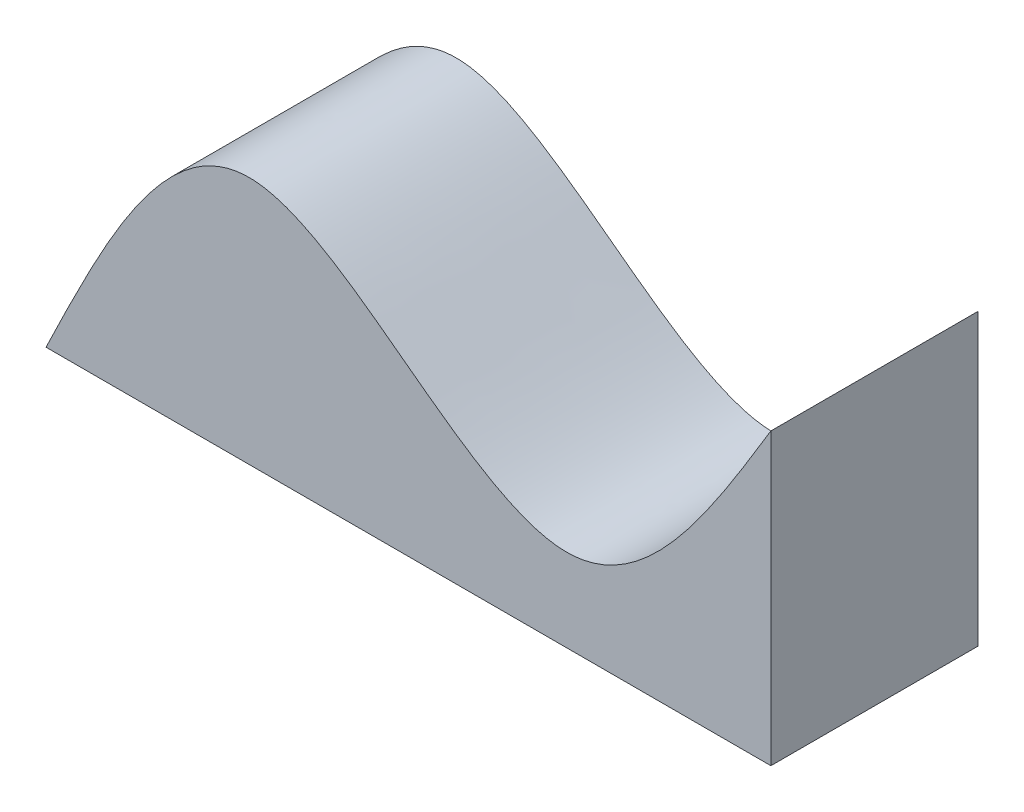
ISO-10303-21;
HEADER;
FILE_DESCRIPTION(('STEP AP214'),'2;1');
FILE_NAME('part.step','',(''),(''),'','','');
FILE_SCHEMA(('AUTOMOTIVE_DESIGN { 1 0 10303 214 1 1 1 1 }'));
ENDSEC;
DATA;
#1=APPLICATION_CONTEXT('core data for automotive mechanical design processes');
#2=APPLICATION_PROTOCOL_DEFINITION('international standard','automotive_design',2000,#1);
#3=PRODUCT_CONTEXT('',#1,'mechanical');
#4=PRODUCT('Part','Part','',(#3));
#5=PRODUCT_RELATED_PRODUCT_CATEGORY('part','',(#4));
#6=PRODUCT_DEFINITION_FORMATION('','',#4);
#7=PRODUCT_DEFINITION_CONTEXT('part definition',#1,'design');
#8=PRODUCT_DEFINITION('design','',#6,#7);
#9=PRODUCT_DEFINITION_SHAPE('','',#8);
#10=(LENGTH_UNIT() NAMED_UNIT(*) SI_UNIT(.MILLI.,.METRE.));
#11=(NAMED_UNIT(*) PLANE_ANGLE_UNIT() SI_UNIT($,.RADIAN.));
#12=(NAMED_UNIT(*) SI_UNIT($,.STERADIAN.) SOLID_ANGLE_UNIT());
#13=UNCERTAINTY_MEASURE_WITH_UNIT(LENGTH_MEASURE(1.E-05),#10,'distance_accuracy_value','');
#14=(GEOMETRIC_REPRESENTATION_CONTEXT(3) GLOBAL_UNCERTAINTY_ASSIGNED_CONTEXT((#13)) GLOBAL_UNIT_ASSIGNED_CONTEXT((#10,
#11,#12)) REPRESENTATION_CONTEXT('',''));
#15=CARTESIAN_POINT('',(0.,0.,0.));
#16=DIRECTION('',(0.,0.,1.));
#17=DIRECTION('',(1.,0.,0.));
#18=AXIS2_PLACEMENT_3D('',#15,#16,#17);
#19=CARTESIAN_POINT('',(35.,14.,10.));
#20=CARTESIAN_POINT('',(31.9413193605141,8.93762404776543,10.));
#21=CARTESIAN_POINT('',(25.2058552241985,-2.21014052452845,10.));
#22=CARTESIAN_POINT('',(9.0923652441554,18.8202864775659,10.));
#23=CARTESIAN_POINT('',(2.94411992329052,6.09403371870198,10.));
#24=CARTESIAN_POINT('',(0.,0.,10.));
#25=B_SPLINE_CURVE_WITH_KNOTS('',3,(#19,#20,#21,#22,#23,#24),.UNSPECIFIED.,.F.,.F.,(4,1,1,4),
(0.,0.30242383969866,0.665961951032433,1.),.UNSPECIFIED.);
#26=DIRECTION('',(0.,0.,-1.));
#27=VECTOR('',#26,1.);
#28=SURFACE_OF_LINEAR_EXTRUSION('',#25,#27);
#29=CARTESIAN_POINT('',(35.,14.,0.));
#30=CARTESIAN_POINT('',(31.9413193605141,8.93762404776543,0.));
#31=CARTESIAN_POINT('',(25.2058552241985,-2.21014052452845,0.));
#32=CARTESIAN_POINT('',(9.0923652441554,18.8202864775659,0.));
#33=CARTESIAN_POINT('',(2.94411992329052,6.09403371870198,0.));
#34=CARTESIAN_POINT('',(0.,0.,0.));
#35=B_SPLINE_CURVE_WITH_KNOTS('',3,(#29,#30,#31,#32,#33,#34),.UNSPECIFIED.,.F.,.F.,(4,1,1,4),
(0.,0.30242383969866,0.665961951032433,1.),.UNSPECIFIED.);
#36=CARTESIAN_POINT('',(35.,14.,0.));
#37=VERTEX_POINT('',#36);
#38=CARTESIAN_POINT('',(0.,0.,0.));
#39=VERTEX_POINT('',#38);
#40=EDGE_CURVE('E82',#37,#39,#35,.T.);
#41=ORIENTED_EDGE('',*,*,#40,.T.);
#42=DIRECTION('',(0.,0.,-1.));
#43=VECTOR('',#42,1.);
#44=CARTESIAN_POINT('',(0.,0.,10.));
#45=LINE('',#44,#43);
#46=CARTESIAN_POINT('',(0.,0.,10.));
#47=VERTEX_POINT('',#46);
#48=EDGE_CURVE('E11',#47,#39,#45,.T.);
#49=ORIENTED_EDGE('',*,*,#48,.F.);
#50=CARTESIAN_POINT('',(35.,14.,10.));
#51=VERTEX_POINT('',#50);
#52=EDGE_CURVE('E76',#51,#47,#25,.T.);
#53=ORIENTED_EDGE('',*,*,#52,.F.);
#54=DIRECTION('',(0.,0.,-1.));
#55=VECTOR('',#54,1.);
#56=CARTESIAN_POINT('',(35.,14.,10.));
#57=LINE('',#56,#55);
#58=EDGE_CURVE('E83',#51,#37,#57,.T.);
#59=ORIENTED_EDGE('',*,*,#58,.T.);
#60=EDGE_LOOP('',(#41,#49,#53,#59));
#61=FACE_BOUND('',#60,.T.);
#62=ADVANCED_FACE('F35',(#61),#28,.F.);
#63=CARTESIAN_POINT('',(35.,0.,10.));
#64=DIRECTION('',(0.,1.,0.));
#65=DIRECTION('',(0.,0.,1.));
#66=AXIS2_PLACEMENT_3D('',#63,#64,#65);
#67=PLANE('',#66);
#68=DIRECTION('',(1.,0.,0.));
#69=VECTOR('',#68,1.);
#70=CARTESIAN_POINT('',(35.,0.,0.));
#71=LINE('',#70,#69);
#72=CARTESIAN_POINT('',(35.,0.,0.));
#73=VERTEX_POINT('',#72);
#74=EDGE_CURVE('E64',#39,#73,#71,.T.);
#75=ORIENTED_EDGE('',*,*,#74,.T.);
#76=DIRECTION('',(0.,0.,-1.));
#77=VECTOR('',#76,1.);
#78=CARTESIAN_POINT('',(35.,0.,10.));
#79=LINE('',#78,#77);
#80=CARTESIAN_POINT('',(35.,0.,10.));
#81=VERTEX_POINT('',#80);
#82=EDGE_CURVE('E44',#81,#73,#79,.T.);
#83=ORIENTED_EDGE('',*,*,#82,.F.);
#84=DIRECTION('',(1.,0.,0.));
#85=VECTOR('',#84,1.);
#86=CARTESIAN_POINT('',(35.,0.,10.));
#87=LINE('',#86,#85);
#88=EDGE_CURVE('E72',#47,#81,#87,.T.);
#89=ORIENTED_EDGE('',*,*,#88,.F.);
#90=ORIENTED_EDGE('',*,*,#48,.T.);
#91=EDGE_LOOP('',(#75,#83,#89,#90));
#92=FACE_BOUND('',#91,.T.);
#93=ADVANCED_FACE('F73',(#92),#67,.F.);
#94=CARTESIAN_POINT('',(35.,14.,10.));
#95=DIRECTION('',(-1.,0.,0.));
#96=DIRECTION('',(0.,0.,1.));
#97=AXIS2_PLACEMENT_3D('',#94,#95,#96);
#98=PLANE('',#97);
#99=DIRECTION('',(0.,1.,0.));
#100=VECTOR('',#99,1.);
#101=CARTESIAN_POINT('',(35.,14.,0.));
#102=LINE('',#101,#100);
#103=EDGE_CURVE('E69',#73,#37,#102,.T.);
#104=ORIENTED_EDGE('',*,*,#103,.T.);
#105=ORIENTED_EDGE('',*,*,#58,.F.);
#106=DIRECTION('',(0.,1.,0.));
#107=VECTOR('',#106,1.);
#108=CARTESIAN_POINT('',(35.,14.,10.));
#109=LINE('',#108,#107);
#110=EDGE_CURVE('E52',#81,#51,#109,.T.);
#111=ORIENTED_EDGE('',*,*,#110,.F.);
#112=ORIENTED_EDGE('',*,*,#82,.T.);
#113=EDGE_LOOP('',(#104,#105,#111,#112));
#114=FACE_BOUND('',#113,.T.);
#115=ADVANCED_FACE('F95',(#114),#98,.F.);
#116=CARTESIAN_POINT('',(16.7484253064697,8.48861976933777,10.));
#117=DIRECTION('',(0.,0.,1.));
#118=DIRECTION('',(1.,0.,0.));
#119=AXIS2_PLACEMENT_3D('',#116,#117,#118);
#120=PLANE('',#119);
#121=ORIENTED_EDGE('',*,*,#52,.T.);
#122=ORIENTED_EDGE('',*,*,#88,.T.);
#123=ORIENTED_EDGE('',*,*,#110,.T.);
#124=EDGE_LOOP('',(#121,#122,#123));
#125=FACE_BOUND('',#124,.T.);
#126=ADVANCED_FACE('F79',(#125),#120,.T.);
#127=CARTESIAN_POINT('',(16.7484253064697,8.48861976933777,0.));
#128=DIRECTION('',(0.,0.,1.));
#129=DIRECTION('',(1.,0.,0.));
#130=AXIS2_PLACEMENT_3D('',#127,#128,#129);
#131=PLANE('',#130);
#132=ORIENTED_EDGE('',*,*,#40,.F.);
#133=ORIENTED_EDGE('',*,*,#103,.F.);
#134=ORIENTED_EDGE('',*,*,#74,.F.);
#135=EDGE_LOOP('',(#132,#133,#134));
#136=FACE_BOUND('',#135,.T.);
#137=ADVANCED_FACE('F96',(#136),#131,.F.);
#138=CLOSED_SHELL('',(#62,#93,#115,#126,#137));
#139=MANIFOLD_SOLID_BREP('B2',#138);
#140=ADVANCED_BREP_SHAPE_REPRESENTATION('',(#18,#139),#14);
#141=SHAPE_DEFINITION_REPRESENTATION(#9,#140);
ENDSEC;
END-ISO-10303-21;
